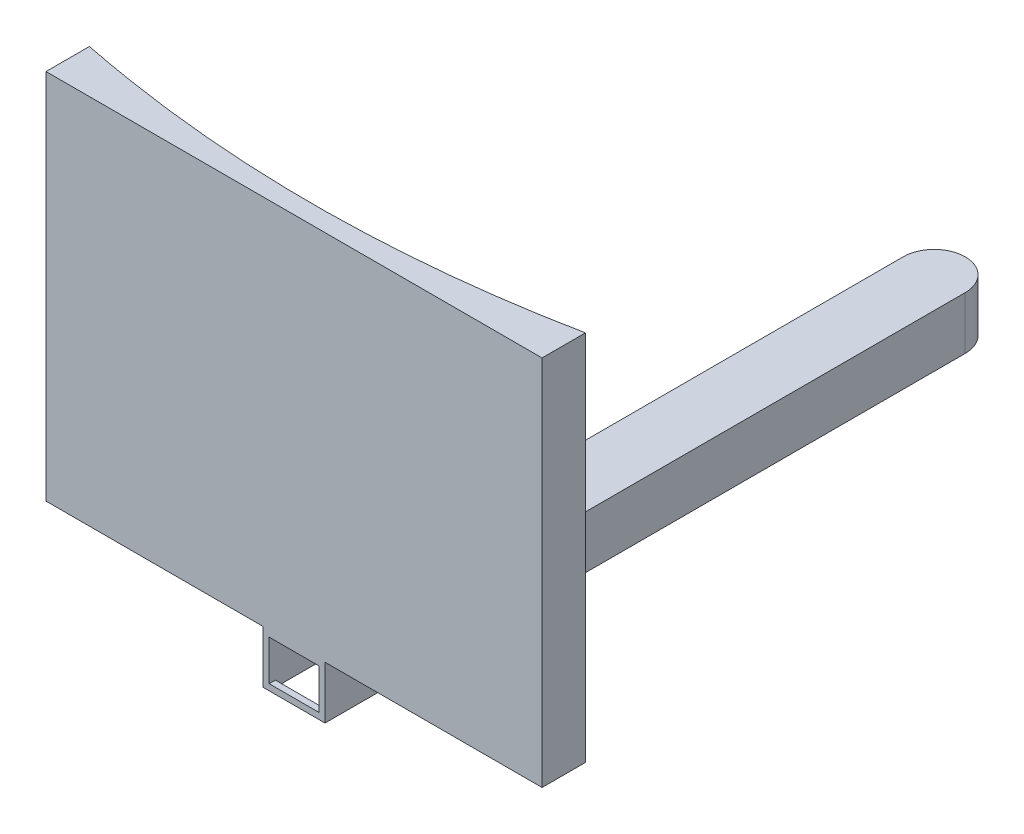
ISO-10303-21;
HEADER;
FILE_DESCRIPTION(('STEP AP214'),'2;1');
FILE_NAME('part.step','',(''),(''),'','','');
FILE_SCHEMA(('AUTOMOTIVE_DESIGN { 1 0 10303 214 1 1 1 1 }'));
ENDSEC;
DATA;
#1=APPLICATION_CONTEXT('core data for automotive mechanical design processes');
#2=APPLICATION_PROTOCOL_DEFINITION('international standard','automotive_design',2000,#1);
#3=PRODUCT_CONTEXT('',#1,'mechanical');
#4=PRODUCT('Part','Part','',(#3));
#5=PRODUCT_RELATED_PRODUCT_CATEGORY('part','',(#4));
#6=PRODUCT_DEFINITION_FORMATION('','',#4);
#7=PRODUCT_DEFINITION_CONTEXT('part definition',#1,'design');
#8=PRODUCT_DEFINITION('design','',#6,#7);
#9=PRODUCT_DEFINITION_SHAPE('','',#8);
#10=(LENGTH_UNIT() NAMED_UNIT(*) SI_UNIT(.MILLI.,.METRE.));
#11=(NAMED_UNIT(*) PLANE_ANGLE_UNIT() SI_UNIT($,.RADIAN.));
#12=(NAMED_UNIT(*) SI_UNIT($,.STERADIAN.) SOLID_ANGLE_UNIT());
#13=UNCERTAINTY_MEASURE_WITH_UNIT(LENGTH_MEASURE(1.E-05),#10,'distance_accuracy_value','');
#14=(GEOMETRIC_REPRESENTATION_CONTEXT(3) GLOBAL_UNCERTAINTY_ASSIGNED_CONTEXT((#13)) GLOBAL_UNIT_ASSIGNED_CONTEXT((#10,
#11,#12)) REPRESENTATION_CONTEXT('',''));
#15=CARTESIAN_POINT('',(0.,0.,0.));
#16=DIRECTION('',(0.,0.,1.));
#17=DIRECTION('',(1.,0.,0.));
#18=AXIS2_PLACEMENT_3D('',#15,#16,#17);
#19=CARTESIAN_POINT('',(0.,0.,200.499999999989));
#20=DIRECTION('',(0.,-1.,0.));
#21=DIRECTION('',(0.,0.,-1.));
#22=AXIS2_PLACEMENT_3D('',#19,#20,#21);
#23=PLANE('',#22);
#24=DIRECTION('',(0.,0.,-1.));
#25=VECTOR('',#24,1.);
#26=CARTESIAN_POINT('',(-10.,0.,206.499999999989));
#27=LINE('',#26,#25);
#28=CARTESIAN_POINT('',(-9.99999999999999,0.,206.499999999989));
#29=VERTEX_POINT('',#28);
#30=CARTESIAN_POINT('',(-9.99999999999699,0.,200.375154287834));
#31=VERTEX_POINT('',#30);
#32=EDGE_CURVE('E214',#29,#31,#27,.T.);
#33=ORIENTED_EDGE('',*,*,#32,.F.);
#34=DIRECTION('',(1.,0.,0.));
#35=VECTOR('',#34,1.);
#36=CARTESIAN_POINT('',(-80.,0.,206.499999999989));
#37=LINE('',#36,#35);
#38=CARTESIAN_POINT('',(-80.,0.,206.499999999989));
#39=VERTEX_POINT('',#38);
#40=EDGE_CURVE('E258',#39,#29,#37,.T.);
#41=ORIENTED_EDGE('',*,*,#40,.F.);
#42=DIRECTION('',(0.,0.,1.));
#43=VECTOR('',#42,1.);
#44=CARTESIAN_POINT('',(-80.0000000000013,0.,192.509889922573));
#45=LINE('',#44,#43);
#46=CARTESIAN_POINT('',(-80.0000000000013,0.,192.509889922573));
#47=VERTEX_POINT('',#46);
#48=EDGE_CURVE('E251',#47,#39,#45,.T.);
#49=ORIENTED_EDGE('',*,*,#48,.F.);
#50=CARTESIAN_POINT('',(225.245130619814,0.,137.154537768553));
#51=CARTESIAN_POINT('',(222.90817603296,0.,138.469074723659));
#52=CARTESIAN_POINT('',(218.204067638298,0.,141.073902870023));
#53=CARTESIAN_POINT('',(208.827276173062,0.,146.100944940152));
#54=CARTESIAN_POINT('',(197.0951136339,0.,152.081763048426));
#55=CARTESIAN_POINT('',(183.020628450953,0.,158.761564513527));
#56=CARTESIAN_POINT('',(164.252323786063,0.,167.009400213228));
#57=CARTESIAN_POINT('',(140.791197461162,0.,176.082259845337));
#58=CARTESIAN_POINT('',(112.635650998168,0.,184.990896120193));
#59=CARTESIAN_POINT('',(84.4784352769108,0.,191.920233494286));
#60=CARTESIAN_POINT('',(46.9335816501035,0.,198.519950199365));
#61=CARTESIAN_POINT('',(-3.53883589099269E-13,0.,201.820033200405));
#62=CARTESIAN_POINT('',(-46.9335816501066,0.,198.519950199364));
#63=CARTESIAN_POINT('',(-84.4784352769144,0.,191.920233494286));
#64=CARTESIAN_POINT('',(-112.635650998168,0.,184.990896120192));
#65=CARTESIAN_POINT('',(-140.791197461168,0.,176.082259845335));
#66=CARTESIAN_POINT('',(-164.252323786066,0.,167.009400213228));
#67=CARTESIAN_POINT('',(-183.020628450954,0.,158.761564513527));
#68=CARTESIAN_POINT('',(-197.095113633908,0.,152.081763048424));
#69=CARTESIAN_POINT('',(-208.827276173067,0.,146.100944940152));
#70=CARTESIAN_POINT('',(-218.204067638301,0.,141.073902870022));
#71=CARTESIAN_POINT('',(-222.908176032963,0.,138.469074723657));
#72=CARTESIAN_POINT('',(-225.245130619819,0.,137.154537768551));
#73=B_SPLINE_CURVE_WITH_KNOTS('',3,(#50,#51,#52,#53,#54,#55,#56,#57,#58,#59,#60,#61,#62,#63,#64,
#65,#66,#67,#68,#69,#70,#71,#72),.UNSPECIFIED.,.F.,.F.,(4,1,1,1,1,1,1,1,1,1,1,1,1,1,1,1,1,1,1,1,
4),(0.496022524355826,0.496146820469706,0.496271116583587,0.496519708811347,0.496768301039108,
0.497016893266869,0.497514077722391,0.498011262177913,0.498508446633435,0.499005631088956,0.5,
0.500994368911044,0.501491553366565,0.501988737822087,0.502485922277609,0.502983106733131,
0.503231698960892,0.503480291188652,0.503728883416413,0.503853179530294,0.503977475644174),.UNSPECIFIED.);
#74=EDGE_CURVE('E228',#31,#47,#73,.T.);
#75=ORIENTED_EDGE('',*,*,#74,.F.);
#76=EDGE_LOOP('',(#33,#41,#49,#75));
#77=FACE_BOUND('',#76,.T.);
#78=ADVANCED_FACE('F37',(#77),#23,.T.);
#79=CARTESIAN_POINT('',(225.245130619814,120.,137.154537768553));
#80=CARTESIAN_POINT('',(222.90817603296,120.,138.469074723659));
#81=CARTESIAN_POINT('',(218.204067638298,120.,141.073902870023));
#82=CARTESIAN_POINT('',(208.827276173062,120.,146.100944940152));
#83=CARTESIAN_POINT('',(197.0951136339,120.,152.081763048426));
#84=CARTESIAN_POINT('',(183.020628450953,120.,158.761564513527));
#85=CARTESIAN_POINT('',(164.252323786063,120.,167.009400213228));
#86=CARTESIAN_POINT('',(140.791197461162,120.,176.082259845337));
#87=CARTESIAN_POINT('',(112.635650998168,120.,184.990896120193));
#88=CARTESIAN_POINT('',(84.4784352769108,120.,191.920233494286));
#89=CARTESIAN_POINT('',(46.9335816501035,120.,198.519950199365));
#90=CARTESIAN_POINT('',(-3.53883589099269E-13,120.,201.820033200405));
#91=CARTESIAN_POINT('',(-46.9335816501066,120.,198.519950199364));
#92=CARTESIAN_POINT('',(-84.4784352769144,120.,191.920233494286));
#93=CARTESIAN_POINT('',(-112.635650998168,120.,184.990896120192));
#94=CARTESIAN_POINT('',(-140.791197461168,120.,176.082259845335));
#95=CARTESIAN_POINT('',(-164.252323786066,120.,167.009400213228));
#96=CARTESIAN_POINT('',(-183.020628450954,120.,158.761564513527));
#97=CARTESIAN_POINT('',(-197.095113633908,120.,152.081763048424));
#98=CARTESIAN_POINT('',(-208.827276173067,120.,146.100944940152));
#99=CARTESIAN_POINT('',(-218.204067638301,120.,141.073902870022));
#100=CARTESIAN_POINT('',(-222.908176032963,120.,138.469074723657));
#101=CARTESIAN_POINT('',(-225.245130619819,120.,137.154537768551));
#102=B_SPLINE_CURVE_WITH_KNOTS('',3,(#79,#80,#81,#82,#83,#84,#85,#86,#87,#88,#89,#90,#91,#92,
#93,#94,#95,#96,#97,#98,#99,#100,#101),.UNSPECIFIED.,.F.,.F.,(4,1,1,1,1,1,1,1,1,1,1,1,1,1,1,1,1,
1,1,1,4),(0.496022524355826,0.496146820469706,0.496271116583587,0.496519708811347,
0.496768301039108,0.497016893266869,0.497514077722391,0.498011262177913,0.498508446633435,
0.499005631088956,0.5,0.500994368911044,0.501491553366565,0.501988737822087,0.502485922277609,
0.502983106733131,0.503231698960892,0.503480291188652,0.503728883416413,0.503853179530294,
0.503977475644174),.UNSPECIFIED.);
#103=DIRECTION('',(0.,-1.,0.));
#104=VECTOR('',#103,1.);
#105=SURFACE_OF_LINEAR_EXTRUSION('',#102,#104);
#106=CARTESIAN_POINT('',(80.,0.,192.509889922572));
#107=VERTEX_POINT('',#106);
#108=CARTESIAN_POINT('',(10.0000000028648,0.,200.375154287762));
#109=VERTEX_POINT('',#108);
#110=EDGE_CURVE('E246',#107,#109,#73,.T.);
#111=ORIENTED_EDGE('',*,*,#110,.T.);
#112=EDGE_CURVE('E252',#109,#31,#73,.T.);
#113=ORIENTED_EDGE('',*,*,#112,.T.);
#114=ORIENTED_EDGE('',*,*,#74,.T.);
#115=DIRECTION('',(0.,-1.,0.));
#116=VECTOR('',#115,1.);
#117=CARTESIAN_POINT('',(-80.0000000000013,120.,192.509889922573));
#118=LINE('',#117,#116);
#119=CARTESIAN_POINT('',(-80.0000000000013,120.,192.509889922573));
#120=VERTEX_POINT('',#119);
#121=EDGE_CURVE('E42',#120,#47,#118,.T.);
#122=ORIENTED_EDGE('',*,*,#121,.F.);
#123=CARTESIAN_POINT('',(80.,120.,192.509889922572));
#124=VERTEX_POINT('',#123);
#125=EDGE_CURVE('E229',#124,#120,#102,.T.);
#126=ORIENTED_EDGE('',*,*,#125,.F.);
#127=DIRECTION('',(0.,-1.,0.));
#128=VECTOR('',#127,1.);
#129=CARTESIAN_POINT('',(80.,120.,192.509889922572));
#130=LINE('',#129,#128);
#131=EDGE_CURVE('E245',#124,#107,#130,.T.);
#132=ORIENTED_EDGE('',*,*,#131,.T.);
#133=EDGE_LOOP('',(#111,#113,#114,#122,#126,#132));
#134=FACE_BOUND('',#133,.T.);
#135=ADVANCED_FACE('F39',(#134),#105,.F.);
#136=CARTESIAN_POINT('',(-80.0000000000013,120.,192.509889922573));
#137=DIRECTION('',(1.,0.,0.));
#138=DIRECTION('',(0.,0.,-1.));
#139=AXIS2_PLACEMENT_3D('',#136,#137,#138);
#140=PLANE('',#139);
#141=ORIENTED_EDGE('',*,*,#48,.T.);
#142=DIRECTION('',(0.,-1.,0.));
#143=VECTOR('',#142,1.);
#144=CARTESIAN_POINT('',(-80.,120.,206.499999999989));
#145=LINE('',#144,#143);
#146=CARTESIAN_POINT('',(-80.,120.,206.499999999989));
#147=VERTEX_POINT('',#146);
#148=EDGE_CURVE('E266',#147,#39,#145,.T.);
#149=ORIENTED_EDGE('',*,*,#148,.F.);
#150=DIRECTION('',(0.,0.,1.));
#151=VECTOR('',#150,1.);
#152=CARTESIAN_POINT('',(-80.0000000000013,120.,192.509889922573));
#153=LINE('',#152,#151);
#154=EDGE_CURVE('E235',#120,#147,#153,.T.);
#155=ORIENTED_EDGE('',*,*,#154,.F.);
#156=ORIENTED_EDGE('',*,*,#121,.T.);
#157=EDGE_LOOP('',(#141,#149,#155,#156));
#158=FACE_BOUND('',#157,.T.);
#159=ADVANCED_FACE('F274',(#158),#140,.F.);
#160=CARTESIAN_POINT('',(-80.,120.,206.499999999989));
#161=DIRECTION('',(0.,0.,-1.));
#162=DIRECTION('',(-1.,0.,0.));
#163=AXIS2_PLACEMENT_3D('',#160,#161,#162);
#164=PLANE('',#163);
#165=DIRECTION('',(-1.,0.,0.));
#166=VECTOR('',#165,1.);
#167=CARTESIAN_POINT('',(7.99999999999997,-2.,206.499999999989));
#168=LINE('',#167,#166);
#169=CARTESIAN_POINT('',(7.99999999999997,-2.,206.499999999989));
#170=VERTEX_POINT('',#169);
#171=CARTESIAN_POINT('',(-7.99999999999999,-2.,206.499999999989));
#172=VERTEX_POINT('',#171);
#173=EDGE_CURVE('E156',#170,#172,#168,.T.);
#174=ORIENTED_EDGE('',*,*,#173,.F.);
#175=DIRECTION('',(0.,1.,0.));
#176=VECTOR('',#175,1.);
#177=CARTESIAN_POINT('',(7.99999999999997,-15.,206.499999999989));
#178=LINE('',#177,#176);
#179=CARTESIAN_POINT('',(7.99999999999997,-15.,206.499999999989));
#180=VERTEX_POINT('',#179);
#181=EDGE_CURVE('E160',#180,#170,#178,.T.);
#182=ORIENTED_EDGE('',*,*,#181,.F.);
#183=DIRECTION('',(1.,0.,0.));
#184=VECTOR('',#183,1.);
#185=CARTESIAN_POINT('',(7.99999999999997,-15.,206.499999999989));
#186=LINE('',#185,#184);
#187=CARTESIAN_POINT('',(-7.99999999999999,-15.,206.499999999989));
#188=VERTEX_POINT('',#187);
#189=EDGE_CURVE('E165',#188,#180,#186,.T.);
#190=ORIENTED_EDGE('',*,*,#189,.F.);
#191=DIRECTION('',(0.,-1.,0.));
#192=VECTOR('',#191,1.);
#193=CARTESIAN_POINT('',(-7.99999999999999,-15.,206.499999999989));
#194=LINE('',#193,#192);
#195=EDGE_CURVE('E148',#172,#188,#194,.T.);
#196=ORIENTED_EDGE('',*,*,#195,.F.);
#197=EDGE_LOOP('',(#174,#182,#190,#196));
#198=FACE_BOUND('',#197,.T.);
#199=ORIENTED_EDGE('',*,*,#40,.T.);
#200=DIRECTION('',(0.,1.,0.));
#201=VECTOR('',#200,1.);
#202=CARTESIAN_POINT('',(-10.,-2.,206.499999999989));
#203=LINE('',#202,#201);
#204=CARTESIAN_POINT('',(-10.,-17.,206.499999999989));
#205=VERTEX_POINT('',#204);
#206=EDGE_CURVE('E220',#205,#29,#203,.T.);
#207=ORIENTED_EDGE('',*,*,#206,.F.);
#208=DIRECTION('',(-1.,0.,0.));
#209=VECTOR('',#208,1.);
#210=CARTESIAN_POINT('',(9.99999999999997,-17.,206.499999999989));
#211=LINE('',#210,#209);
#212=CARTESIAN_POINT('',(9.99999999999997,-17.,206.499999999989));
#213=VERTEX_POINT('',#212);
#214=EDGE_CURVE('E203',#213,#205,#211,.T.);
#215=ORIENTED_EDGE('',*,*,#214,.F.);
#216=DIRECTION('',(0.,1.,0.));
#217=VECTOR('',#216,1.);
#218=CARTESIAN_POINT('',(9.99999999999997,-2.,206.499999999989));
#219=LINE('',#218,#217);
#220=CARTESIAN_POINT('',(9.99999999999997,0.,206.499999999989));
#221=VERTEX_POINT('',#220);
#222=EDGE_CURVE('E223',#213,#221,#219,.T.);
#223=ORIENTED_EDGE('',*,*,#222,.T.);
#224=CARTESIAN_POINT('',(80.,0.,206.499999999989));
#225=VERTEX_POINT('',#224);
#226=EDGE_CURVE('E257',#221,#225,#37,.T.);
#227=ORIENTED_EDGE('',*,*,#226,.T.);
#228=DIRECTION('',(0.,-1.,0.));
#229=VECTOR('',#228,1.);
#230=CARTESIAN_POINT('',(80.,120.,206.499999999989));
#231=LINE('',#230,#229);
#232=CARTESIAN_POINT('',(80.,120.,206.499999999989));
#233=VERTEX_POINT('',#232);
#234=EDGE_CURVE('E264',#233,#225,#231,.T.);
#235=ORIENTED_EDGE('',*,*,#234,.F.);
#236=DIRECTION('',(1.,0.,0.));
#237=VECTOR('',#236,1.);
#238=CARTESIAN_POINT('',(-80.,120.,206.499999999989));
#239=LINE('',#238,#237);
#240=EDGE_CURVE('E241',#147,#233,#239,.T.);
#241=ORIENTED_EDGE('',*,*,#240,.F.);
#242=ORIENTED_EDGE('',*,*,#148,.T.);
#243=EDGE_LOOP('',(#199,#207,#215,#223,#227,#235,#241,#242));
#244=FACE_BOUND('',#243,.T.);
#245=ADVANCED_FACE('F162',(#198,#244),#164,.F.);
#246=CARTESIAN_POINT('',(80.,120.,192.509889922572));
#247=DIRECTION('',(-1.,0.,0.));
#248=DIRECTION('',(0.,0.,1.));
#249=AXIS2_PLACEMENT_3D('',#246,#247,#248);
#250=PLANE('',#249);
#251=DIRECTION('',(0.,0.,-1.));
#252=VECTOR('',#251,1.);
#253=CARTESIAN_POINT('',(80.,0.,192.509889922572));
#254=LINE('',#253,#252);
#255=EDGE_CURVE('E236',#225,#107,#254,.T.);
#256=ORIENTED_EDGE('',*,*,#255,.T.);
#257=ORIENTED_EDGE('',*,*,#131,.F.);
#258=DIRECTION('',(0.,0.,-1.));
#259=VECTOR('',#258,1.);
#260=CARTESIAN_POINT('',(80.,120.,192.509889922572));
#261=LINE('',#260,#259);
#262=EDGE_CURVE('E243',#233,#124,#261,.T.);
#263=ORIENTED_EDGE('',*,*,#262,.F.);
#264=ORIENTED_EDGE('',*,*,#234,.T.);
#265=EDGE_LOOP('',(#256,#257,#263,#264));
#266=FACE_BOUND('',#265,.T.);
#267=ADVANCED_FACE('F301',(#266),#250,.F.);
#268=CARTESIAN_POINT('',(0.,120.,200.499999999989));
#269=DIRECTION('',(0.,-1.,0.));
#270=DIRECTION('',(0.,0.,-1.));
#271=AXIS2_PLACEMENT_3D('',#268,#269,#270);
#272=PLANE('',#271);
#273=ORIENTED_EDGE('',*,*,#125,.T.);
#274=ORIENTED_EDGE('',*,*,#154,.T.);
#275=ORIENTED_EDGE('',*,*,#240,.T.);
#276=ORIENTED_EDGE('',*,*,#262,.T.);
#277=EDGE_LOOP('',(#273,#274,#275,#276));
#278=FACE_BOUND('',#277,.T.);
#279=ADVANCED_FACE('F314',(#278),#272,.F.);
#280=DIRECTION('',(0.,0.,1.));
#281=VECTOR('',#280,1.);
#282=CARTESIAN_POINT('',(10.,0.,0.));
#283=LINE('',#282,#281);
#284=EDGE_CURVE('E11',#109,#221,#283,.T.);
#285=ORIENTED_EDGE('',*,*,#284,.F.);
#286=ORIENTED_EDGE('',*,*,#110,.F.);
#287=ORIENTED_EDGE('',*,*,#255,.F.);
#288=ORIENTED_EDGE('',*,*,#226,.F.);
#289=EDGE_LOOP('',(#285,#286,#287,#288));
#290=FACE_BOUND('',#289,.T.);
#291=ADVANCED_FACE('F304',(#290),#23,.T.);
#292=CARTESIAN_POINT('',(0.,0.,0.));
#293=DIRECTION('',(0.,1.,0.));
#294=DIRECTION('',(0.,0.,1.));
#295=AXIS2_PLACEMENT_3D('',#292,#293,#294);
#296=PLANE('',#295);
#297=ORIENTED_EDGE('',*,*,#112,.F.);
#298=CARTESIAN_POINT('',(10.,0.,0.));
#299=VERTEX_POINT('',#298);
#300=EDGE_CURVE('E48',#299,#109,#283,.T.);
#301=ORIENTED_EDGE('',*,*,#300,.F.);
#302=CARTESIAN_POINT('',(0.,0.,0.));
#303=DIRECTION('',(0.,-1.,0.));
#304=DIRECTION('',(0.,0.,1.));
#305=AXIS2_PLACEMENT_3D('',#302,#303,#304);
#306=CIRCLE('',#305,10.);
#307=CARTESIAN_POINT('',(-10.,0.,0.));
#308=VERTEX_POINT('',#307);
#309=EDGE_CURVE('E209',#308,#299,#306,.T.);
#310=ORIENTED_EDGE('',*,*,#309,.F.);
#311=EDGE_CURVE('E213',#31,#308,#27,.T.);
#312=ORIENTED_EDGE('',*,*,#311,.F.);
#313=EDGE_LOOP('',(#297,#301,#310,#312));
#314=FACE_BOUND('',#313,.T.);
#315=ADVANCED_FACE('F306',(#314),#296,.T.);
#316=CARTESIAN_POINT('',(0.,-2.,0.));
#317=DIRECTION('',(0.,1.,0.));
#318=DIRECTION('',(0.,0.,1.));
#319=AXIS2_PLACEMENT_3D('',#316,#317,#318);
#320=CYLINDRICAL_SURFACE('',#319,10.);
#321=ORIENTED_EDGE('',*,*,#309,.T.);
#322=DIRECTION('',(0.,1.,0.));
#323=VECTOR('',#322,1.);
#324=CARTESIAN_POINT('',(10.,-2.,0.));
#325=LINE('',#324,#323);
#326=CARTESIAN_POINT('',(10.,-17.,0.));
#327=VERTEX_POINT('',#326);
#328=EDGE_CURVE('E226',#327,#299,#325,.T.);
#329=ORIENTED_EDGE('',*,*,#328,.F.);
#330=CARTESIAN_POINT('',(0.,-17.,0.));
#331=DIRECTION('',(0.,-1.,0.));
#332=DIRECTION('',(0.,0.,-1.));
#333=AXIS2_PLACEMENT_3D('',#330,#331,#332);
#334=CIRCLE('',#333,10.);
#335=CARTESIAN_POINT('',(-10.,-17.,0.));
#336=VERTEX_POINT('',#335);
#337=EDGE_CURVE('E197',#336,#327,#334,.T.);
#338=ORIENTED_EDGE('',*,*,#337,.F.);
#339=DIRECTION('',(0.,1.,0.));
#340=VECTOR('',#339,1.);
#341=CARTESIAN_POINT('',(-10.,-2.,0.));
#342=LINE('',#341,#340);
#343=EDGE_CURVE('E217',#336,#308,#342,.T.);
#344=ORIENTED_EDGE('',*,*,#343,.T.);
#345=EDGE_LOOP('',(#321,#329,#338,#344));
#346=FACE_BOUND('',#345,.T.);
#347=ADVANCED_FACE('F291',(#346),#320,.T.);
#348=CARTESIAN_POINT('',(10.,-2.,0.));
#349=DIRECTION('',(-1.,0.,0.));
#350=DIRECTION('',(0.,0.,1.));
#351=AXIS2_PLACEMENT_3D('',#348,#349,#350);
#352=PLANE('',#351);
#353=ORIENTED_EDGE('',*,*,#300,.T.);
#354=ORIENTED_EDGE('',*,*,#284,.T.);
#355=ORIENTED_EDGE('',*,*,#222,.F.);
#356=DIRECTION('',(0.,0.,1.));
#357=VECTOR('',#356,1.);
#358=CARTESIAN_POINT('',(10.,-17.,0.));
#359=LINE('',#358,#357);
#360=EDGE_CURVE('E200',#327,#213,#359,.T.);
#361=ORIENTED_EDGE('',*,*,#360,.F.);
#362=ORIENTED_EDGE('',*,*,#328,.T.);
#363=EDGE_LOOP('',(#353,#354,#355,#361,#362));
#364=FACE_BOUND('',#363,.T.);
#365=ADVANCED_FACE('F295',(#364),#352,.F.);
#366=CARTESIAN_POINT('',(-10.,-2.,206.499999999989));
#367=DIRECTION('',(1.,0.,0.));
#368=DIRECTION('',(0.,0.,-1.));
#369=AXIS2_PLACEMENT_3D('',#366,#367,#368);
#370=PLANE('',#369);
#371=ORIENTED_EDGE('',*,*,#32,.T.);
#372=ORIENTED_EDGE('',*,*,#311,.T.);
#373=ORIENTED_EDGE('',*,*,#343,.F.);
#374=DIRECTION('',(0.,0.,-1.));
#375=VECTOR('',#374,1.);
#376=CARTESIAN_POINT('',(-10.,-17.,206.499999999989));
#377=LINE('',#376,#375);
#378=EDGE_CURVE('E206',#205,#336,#377,.T.);
#379=ORIENTED_EDGE('',*,*,#378,.F.);
#380=ORIENTED_EDGE('',*,*,#206,.T.);
#381=EDGE_LOOP('',(#371,#372,#373,#379,#380));
#382=FACE_BOUND('',#381,.T.);
#383=ADVANCED_FACE('F285',(#382),#370,.F.);
#384=CARTESIAN_POINT('',(0.,-17.,0.));
#385=DIRECTION('',(0.,-1.,0.));
#386=DIRECTION('',(0.,0.,-1.));
#387=AXIS2_PLACEMENT_3D('',#384,#385,#386);
#388=PLANE('',#387);
#389=ORIENTED_EDGE('',*,*,#337,.T.);
#390=ORIENTED_EDGE('',*,*,#360,.T.);
#391=ORIENTED_EDGE('',*,*,#214,.T.);
#392=ORIENTED_EDGE('',*,*,#378,.T.);
#393=EDGE_LOOP('',(#389,#390,#391,#392));
#394=FACE_BOUND('',#393,.T.);
#395=DIRECTION('',(0.,0.,1.));
#396=VECTOR('',#395,1.);
#397=CARTESIAN_POINT('',(8.,-17.,0.));
#398=LINE('',#397,#396);
#399=CARTESIAN_POINT('',(8.,-17.,0.));
#400=VERTEX_POINT('',#399);
#401=CARTESIAN_POINT('',(8.,-17.,204.499999999989));
#402=VERTEX_POINT('',#401);
#403=EDGE_CURVE('E178',#400,#402,#398,.T.);
#404=ORIENTED_EDGE('',*,*,#403,.F.);
#405=CARTESIAN_POINT('',(0.,-17.,0.));
#406=DIRECTION('',(0.,-1.,0.));
#407=DIRECTION('',(0.,0.,-1.));
#408=AXIS2_PLACEMENT_3D('',#405,#406,#407);
#409=CIRCLE('',#408,8.);
#410=CARTESIAN_POINT('',(-8.,-17.,0.));
#411=VERTEX_POINT('',#410);
#412=EDGE_CURVE('E153',#411,#400,#409,.T.);
#413=ORIENTED_EDGE('',*,*,#412,.F.);
#414=DIRECTION('',(0.,0.,-1.));
#415=VECTOR('',#414,1.);
#416=CARTESIAN_POINT('',(-8.,-17.,204.499999999989));
#417=LINE('',#416,#415);
#418=CARTESIAN_POINT('',(-8.,-17.,204.499999999989));
#419=VERTEX_POINT('',#418);
#420=EDGE_CURVE('E183',#419,#411,#417,.T.);
#421=ORIENTED_EDGE('',*,*,#420,.F.);
#422=DIRECTION('',(-1.,0.,0.));
#423=VECTOR('',#422,1.);
#424=CARTESIAN_POINT('',(8.,-17.,204.499999999989));
#425=LINE('',#424,#423);
#426=EDGE_CURVE('E180',#402,#419,#425,.T.);
#427=ORIENTED_EDGE('',*,*,#426,.F.);
#428=EDGE_LOOP('',(#404,#413,#421,#427));
#429=FACE_BOUND('',#428,.T.);
#430=ADVANCED_FACE('F288',(#394,#429),#388,.T.);
#431=CARTESIAN_POINT('',(0.,-17.,0.));
#432=DIRECTION('',(0.,1.,0.));
#433=DIRECTION('',(0.,0.,1.));
#434=AXIS2_PLACEMENT_3D('',#431,#432,#433);
#435=CYLINDRICAL_SURFACE('',#434,8.);
#436=CARTESIAN_POINT('',(0.,-2.,0.));
#437=DIRECTION('',(0.,-1.,0.));
#438=DIRECTION('',(0.,0.,-1.));
#439=AXIS2_PLACEMENT_3D('',#436,#437,#438);
#440=CIRCLE('',#439,8.);
#441=CARTESIAN_POINT('',(-8.,-2.,0.));
#442=VERTEX_POINT('',#441);
#443=CARTESIAN_POINT('',(8.,-2.,0.));
#444=VERTEX_POINT('',#443);
#445=EDGE_CURVE('E176',#442,#444,#440,.T.);
#446=ORIENTED_EDGE('',*,*,#445,.F.);
#447=DIRECTION('',(0.,1.,0.));
#448=VECTOR('',#447,1.);
#449=CARTESIAN_POINT('',(-8.,-17.,0.));
#450=LINE('',#449,#448);
#451=EDGE_CURVE('E151',#411,#442,#450,.T.);
#452=ORIENTED_EDGE('',*,*,#451,.F.);
#453=ORIENTED_EDGE('',*,*,#412,.T.);
#454=DIRECTION('',(0.,1.,0.));
#455=VECTOR('',#454,1.);
#456=CARTESIAN_POINT('',(8.,-17.,0.));
#457=LINE('',#456,#455);
#458=EDGE_CURVE('E194',#400,#444,#457,.T.);
#459=ORIENTED_EDGE('',*,*,#458,.T.);
#460=EDGE_LOOP('',(#446,#452,#453,#459));
#461=FACE_BOUND('',#460,.T.);
#462=ADVANCED_FACE('F394',(#461),#435,.F.);
#463=CARTESIAN_POINT('',(8.,-17.,0.));
#464=DIRECTION('',(-1.,0.,0.));
#465=DIRECTION('',(0.,0.,1.));
#466=AXIS2_PLACEMENT_3D('',#463,#464,#465);
#467=PLANE('',#466);
#468=DIRECTION('',(0.,1.,0.));
#469=VECTOR('',#468,1.);
#470=CARTESIAN_POINT('',(8.,-17.,204.499999999989));
#471=LINE('',#470,#469);
#472=CARTESIAN_POINT('',(7.99999999999997,-15.,204.499999999989));
#473=VERTEX_POINT('',#472);
#474=EDGE_CURVE('E191',#402,#473,#471,.T.);
#475=ORIENTED_EDGE('',*,*,#474,.T.);
#476=DIRECTION('',(0.,0.,1.));
#477=VECTOR('',#476,1.);
#478=CARTESIAN_POINT('',(7.99999999999997,-15.,191.499999999989));
#479=LINE('',#478,#477);
#480=EDGE_CURVE('E171',#473,#180,#479,.T.);
#481=ORIENTED_EDGE('',*,*,#480,.T.);
#482=ORIENTED_EDGE('',*,*,#181,.T.);
#483=DIRECTION('',(0.,0.,1.));
#484=VECTOR('',#483,1.);
#485=CARTESIAN_POINT('',(8.,-2.,0.));
#486=LINE('',#485,#484);
#487=EDGE_CURVE('E55',#444,#170,#486,.T.);
#488=ORIENTED_EDGE('',*,*,#487,.F.);
#489=ORIENTED_EDGE('',*,*,#458,.F.);
#490=ORIENTED_EDGE('',*,*,#403,.T.);
#491=EDGE_LOOP('',(#475,#481,#482,#488,#489,#490));
#492=FACE_BOUND('',#491,.T.);
#493=ADVANCED_FACE('F403',(#492),#467,.T.);
#494=CARTESIAN_POINT('',(8.,-17.,204.499999999989));
#495=DIRECTION('',(0.,0.,-1.));
#496=DIRECTION('',(-1.,0.,0.));
#497=AXIS2_PLACEMENT_3D('',#494,#495,#496);
#498=PLANE('',#497);
#499=DIRECTION('',(-1.,0.,0.));
#500=VECTOR('',#499,1.);
#501=CARTESIAN_POINT('',(8.,-15.,204.499999999989));
#502=LINE('',#501,#500);
#503=CARTESIAN_POINT('',(-7.99999999999999,-15.,204.499999999989));
#504=VERTEX_POINT('',#503);
#505=EDGE_CURVE('E173',#473,#504,#502,.T.);
#506=ORIENTED_EDGE('',*,*,#505,.F.);
#507=ORIENTED_EDGE('',*,*,#474,.F.);
#508=ORIENTED_EDGE('',*,*,#426,.T.);
#509=DIRECTION('',(0.,1.,0.));
#510=VECTOR('',#509,1.);
#511=CARTESIAN_POINT('',(-8.,-17.,204.499999999989));
#512=LINE('',#511,#510);
#513=EDGE_CURVE('E188',#419,#504,#512,.T.);
#514=ORIENTED_EDGE('',*,*,#513,.T.);
#515=EDGE_LOOP('',(#506,#507,#508,#514));
#516=FACE_BOUND('',#515,.T.);
#517=ADVANCED_FACE('F414',(#516),#498,.T.);
#518=CARTESIAN_POINT('',(-8.,-17.,204.499999999989));
#519=DIRECTION('',(1.,0.,0.));
#520=DIRECTION('',(0.,0.,-1.));
#521=AXIS2_PLACEMENT_3D('',#518,#519,#520);
#522=PLANE('',#521);
#523=DIRECTION('',(0.,0.,-1.));
#524=VECTOR('',#523,1.);
#525=CARTESIAN_POINT('',(-8.,-2.,204.499999999989));
#526=LINE('',#525,#524);
#527=EDGE_CURVE('E60',#172,#442,#526,.T.);
#528=ORIENTED_EDGE('',*,*,#527,.F.);
#529=ORIENTED_EDGE('',*,*,#195,.T.);
#530=DIRECTION('',(0.,0.,1.));
#531=VECTOR('',#530,1.);
#532=CARTESIAN_POINT('',(-7.99999999999999,-15.,191.499999999989));
#533=LINE('',#532,#531);
#534=EDGE_CURVE('E167',#504,#188,#533,.T.);
#535=ORIENTED_EDGE('',*,*,#534,.F.);
#536=ORIENTED_EDGE('',*,*,#513,.F.);
#537=ORIENTED_EDGE('',*,*,#420,.T.);
#538=ORIENTED_EDGE('',*,*,#451,.T.);
#539=EDGE_LOOP('',(#528,#529,#535,#536,#537,#538));
#540=FACE_BOUND('',#539,.T.);
#541=ADVANCED_FACE('F145',(#540),#522,.T.);
#542=CARTESIAN_POINT('',(0.,-2.,0.));
#543=DIRECTION('',(0.,1.,0.));
#544=DIRECTION('',(0.,0.,1.));
#545=AXIS2_PLACEMENT_3D('',#542,#543,#544);
#546=PLANE('',#545);
#547=ORIENTED_EDGE('',*,*,#527,.T.);
#548=ORIENTED_EDGE('',*,*,#445,.T.);
#549=ORIENTED_EDGE('',*,*,#487,.T.);
#550=ORIENTED_EDGE('',*,*,#173,.T.);
#551=EDGE_LOOP('',(#547,#548,#549,#550));
#552=FACE_BOUND('',#551,.T.);
#553=ADVANCED_FACE('F157',(#552),#546,.F.);
#554=CARTESIAN_POINT('',(7.99999999999997,-15.,191.499999999989));
#555=DIRECTION('',(0.,-1.,0.));
#556=DIRECTION('',(0.,0.,-1.));
#557=AXIS2_PLACEMENT_3D('',#554,#555,#556);
#558=PLANE('',#557);
#559=ORIENTED_EDGE('',*,*,#505,.T.);
#560=ORIENTED_EDGE('',*,*,#534,.T.);
#561=ORIENTED_EDGE('',*,*,#189,.T.);
#562=ORIENTED_EDGE('',*,*,#480,.F.);
#563=EDGE_LOOP('',(#559,#560,#561,#562));
#564=FACE_BOUND('',#563,.T.);
#565=ADVANCED_FACE('F435',(#564),#558,.F.);
#566=CLOSED_SHELL('',(#78,#135,#159,#245,#267,#279,#291,#315,#347,#365,#383,#430,#462,#493,#517,
#541,#553,#565));
#567=MANIFOLD_SOLID_BREP('B2',#566);
#568=ADVANCED_BREP_SHAPE_REPRESENTATION('',(#18,#567),#14);
#569=SHAPE_DEFINITION_REPRESENTATION(#9,#568);
ENDSEC;
END-ISO-10303-21;
